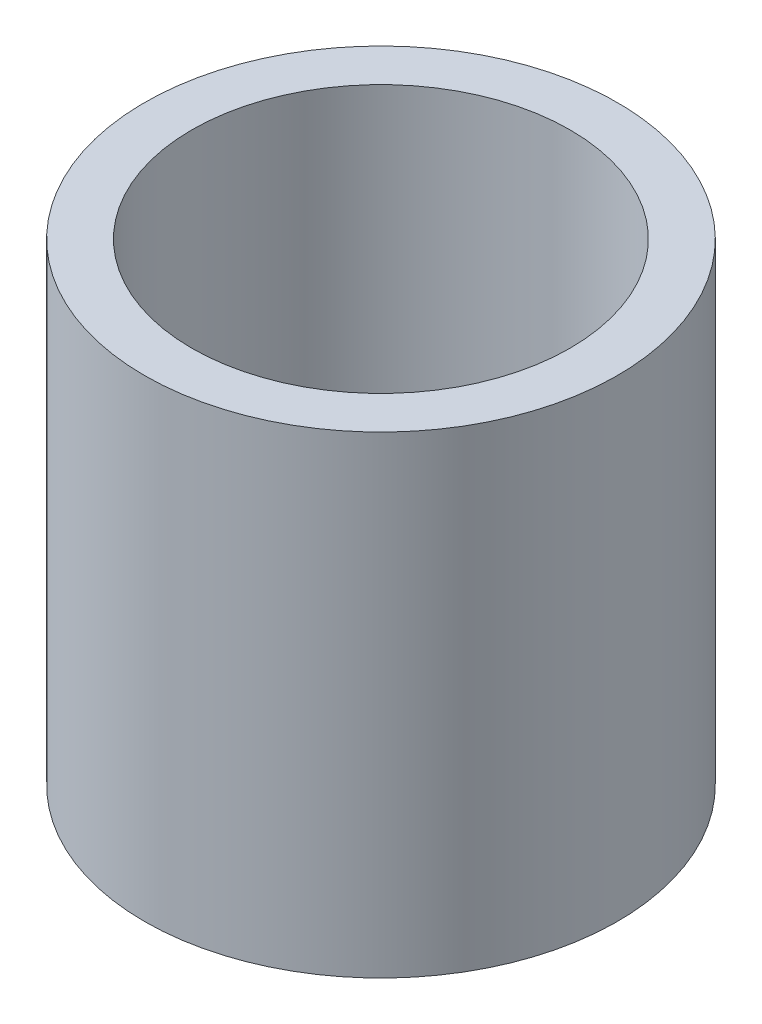
ISO-10303-21;
HEADER;
FILE_DESCRIPTION(('STEP AP214'),'2;1');
FILE_NAME('part.step','',(''),(''),'','','');
FILE_SCHEMA(('AUTOMOTIVE_DESIGN { 1 0 10303 214 1 1 1 1 }'));
ENDSEC;
DATA;
#1=APPLICATION_CONTEXT('core data for automotive mechanical design processes');
#2=APPLICATION_PROTOCOL_DEFINITION('international standard','automotive_design',2000,#1);
#3=PRODUCT_CONTEXT('',#1,'mechanical');
#4=PRODUCT('Part','Part','',(#3));
#5=PRODUCT_RELATED_PRODUCT_CATEGORY('part','',(#4));
#6=PRODUCT_DEFINITION_FORMATION('','',#4);
#7=PRODUCT_DEFINITION_CONTEXT('part definition',#1,'design');
#8=PRODUCT_DEFINITION('design','',#6,#7);
#9=PRODUCT_DEFINITION_SHAPE('','',#8);
#10=(LENGTH_UNIT() NAMED_UNIT(*) SI_UNIT(.MILLI.,.METRE.));
#11=(NAMED_UNIT(*) PLANE_ANGLE_UNIT() SI_UNIT($,.RADIAN.));
#12=(NAMED_UNIT(*) SI_UNIT($,.STERADIAN.) SOLID_ANGLE_UNIT());
#13=UNCERTAINTY_MEASURE_WITH_UNIT(LENGTH_MEASURE(1.E-05),#10,'distance_accuracy_value','');
#14=(GEOMETRIC_REPRESENTATION_CONTEXT(3) GLOBAL_UNCERTAINTY_ASSIGNED_CONTEXT((#13)) GLOBAL_UNIT_ASSIGNED_CONTEXT((#10,
#11,#12)) REPRESENTATION_CONTEXT('',''));
#15=CARTESIAN_POINT('',(0.,0.,0.));
#16=DIRECTION('',(0.,0.,1.));
#17=DIRECTION('',(1.,0.,0.));
#18=AXIS2_PLACEMENT_3D('',#15,#16,#17);
#19=CARTESIAN_POINT('',(0.,4.,0.));
#20=DIRECTION('',(0.,1.,0.));
#21=DIRECTION('',(0.,0.,1.));
#22=AXIS2_PLACEMENT_3D('',#19,#20,#21);
#23=PLANE('',#22);
#24=CARTESIAN_POINT('',(0.,4.,0.));
#25=DIRECTION('',(0.,1.,0.));
#26=DIRECTION('',(0.,0.,1.));
#27=AXIS2_PLACEMENT_3D('',#24,#25,#26);
#28=CIRCLE('',#27,4.);
#29=CARTESIAN_POINT('',(0.,4.,4.));
#30=VERTEX_POINT('',#29);
#31=EDGE_CURVE('E42',#30,#30,#28,.F.);
#32=ORIENTED_EDGE('',*,*,#31,.F.);
#33=EDGE_LOOP('',(#32));
#34=FACE_BOUND('',#33,.T.);
#35=CARTESIAN_POINT('',(0.,4.,0.));
#36=DIRECTION('',(0.,1.,0.));
#37=DIRECTION('',(0.,0.,1.));
#38=AXIS2_PLACEMENT_3D('',#35,#36,#37);
#39=CIRCLE('',#38,2.1);
#40=CARTESIAN_POINT('',(0.,4.,2.1));
#41=VERTEX_POINT('',#40);
#42=EDGE_CURVE('E10',#41,#41,#39,.T.);
#43=ORIENTED_EDGE('',*,*,#42,.F.);
#44=EDGE_LOOP('',(#43));
#45=FACE_BOUND('',#44,.T.);
#46=ADVANCED_FACE('F31',(#34,#45),#23,.T.);
#47=CARTESIAN_POINT('',(0.,0.,0.));
#48=DIRECTION('',(0.,1.,0.));
#49=DIRECTION('',(0.,0.,1.));
#50=AXIS2_PLACEMENT_3D('',#47,#48,#49);
#51=PLANE('',#50);
#52=CARTESIAN_POINT('',(0.,0.,0.));
#53=DIRECTION('',(0.,1.,0.));
#54=DIRECTION('',(0.,0.,1.));
#55=AXIS2_PLACEMENT_3D('',#52,#53,#54);
#56=CIRCLE('',#55,2.1);
#57=CARTESIAN_POINT('',(0.,0.,2.1));
#58=VERTEX_POINT('',#57);
#59=EDGE_CURVE('E35',#58,#58,#56,.T.);
#60=ORIENTED_EDGE('',*,*,#59,.T.);
#61=EDGE_LOOP('',(#60));
#62=FACE_BOUND('',#61,.T.);
#63=CARTESIAN_POINT('',(0.,0.,0.));
#64=DIRECTION('',(0.,1.,0.));
#65=DIRECTION('',(0.,0.,1.));
#66=AXIS2_PLACEMENT_3D('',#63,#64,#65);
#67=CIRCLE('',#66,5.);
#68=CARTESIAN_POINT('',(0.,0.,5.));
#69=VERTEX_POINT('',#68);
#70=EDGE_CURVE('E47',#69,#69,#67,.T.);
#71=ORIENTED_EDGE('',*,*,#70,.F.);
#72=EDGE_LOOP('',(#71));
#73=FACE_BOUND('',#72,.T.);
#74=ADVANCED_FACE('F33',(#62,#73),#51,.F.);
#75=CARTESIAN_POINT('',(0.,4.,0.));
#76=DIRECTION('',(0.,-1.,0.));
#77=DIRECTION('',(0.,0.,-1.));
#78=AXIS2_PLACEMENT_3D('',#75,#76,#77);
#79=CYLINDRICAL_SURFACE('',#78,2.1);
#80=ORIENTED_EDGE('',*,*,#42,.T.);
#81=EDGE_LOOP('',(#80));
#82=FACE_BOUND('',#81,.T.);
#83=ORIENTED_EDGE('',*,*,#59,.F.);
#84=EDGE_LOOP('',(#83));
#85=FACE_BOUND('',#84,.T.);
#86=ADVANCED_FACE('F61',(#82,#85),#79,.F.);
#87=CARTESIAN_POINT('',(0.,10.,0.));
#88=DIRECTION('',(0.,1.,0.));
#89=DIRECTION('',(0.,0.,1.));
#90=AXIS2_PLACEMENT_3D('',#87,#88,#89);
#91=PLANE('',#90);
#92=CARTESIAN_POINT('',(0.,10.,0.));
#93=DIRECTION('',(0.,1.,0.));
#94=DIRECTION('',(0.,0.,1.));
#95=AXIS2_PLACEMENT_3D('',#92,#93,#94);
#96=CIRCLE('',#95,5.);
#97=CARTESIAN_POINT('',(0.,10.,5.));
#98=VERTEX_POINT('',#97);
#99=EDGE_CURVE('E46',#98,#98,#96,.T.);
#100=ORIENTED_EDGE('',*,*,#99,.T.);
#101=EDGE_LOOP('',(#100));
#102=FACE_BOUND('',#101,.T.);
#103=CARTESIAN_POINT('',(0.,10.,0.));
#104=DIRECTION('',(0.,1.,0.));
#105=DIRECTION('',(0.,0.,1.));
#106=AXIS2_PLACEMENT_3D('',#103,#104,#105);
#107=CIRCLE('',#106,4.);
#108=CARTESIAN_POINT('',(0.,10.,4.));
#109=VERTEX_POINT('',#108);
#110=EDGE_CURVE('E50',#109,#109,#107,.T.);
#111=ORIENTED_EDGE('',*,*,#110,.F.);
#112=EDGE_LOOP('',(#111));
#113=FACE_BOUND('',#112,.T.);
#114=ADVANCED_FACE('F58',(#102,#113),#91,.T.);
#115=CARTESIAN_POINT('',(0.,10.,0.));
#116=DIRECTION('',(0.,-1.,0.));
#117=DIRECTION('',(0.,0.,-1.));
#118=AXIS2_PLACEMENT_3D('',#115,#116,#117);
#119=CYLINDRICAL_SURFACE('',#118,5.);
#120=ORIENTED_EDGE('',*,*,#99,.F.);
#121=EDGE_LOOP('',(#120));
#122=FACE_BOUND('',#121,.T.);
#123=ORIENTED_EDGE('',*,*,#70,.T.);
#124=EDGE_LOOP('',(#123));
#125=FACE_BOUND('',#124,.T.);
#126=ADVANCED_FACE('F60',(#122,#125),#119,.T.);
#127=CARTESIAN_POINT('',(0.,10.,0.));
#128=DIRECTION('',(0.,-1.,0.));
#129=DIRECTION('',(0.,0.,-1.));
#130=AXIS2_PLACEMENT_3D('',#127,#128,#129);
#131=CYLINDRICAL_SURFACE('',#130,4.);
#132=ORIENTED_EDGE('',*,*,#31,.T.);
#133=EDGE_LOOP('',(#132));
#134=FACE_BOUND('',#133,.T.);
#135=ORIENTED_EDGE('',*,*,#110,.T.);
#136=EDGE_LOOP('',(#135));
#137=FACE_BOUND('',#136,.T.);
#138=ADVANCED_FACE('F56',(#134,#137),#131,.F.);
#139=CLOSED_SHELL('',(#46,#74,#86,#114,#126,#138));
#140=MANIFOLD_SOLID_BREP('B2',#139);
#141=ADVANCED_BREP_SHAPE_REPRESENTATION('',(#18,#140),#14);
#142=SHAPE_DEFINITION_REPRESENTATION(#9,#141);
ENDSEC;
END-ISO-10303-21;
